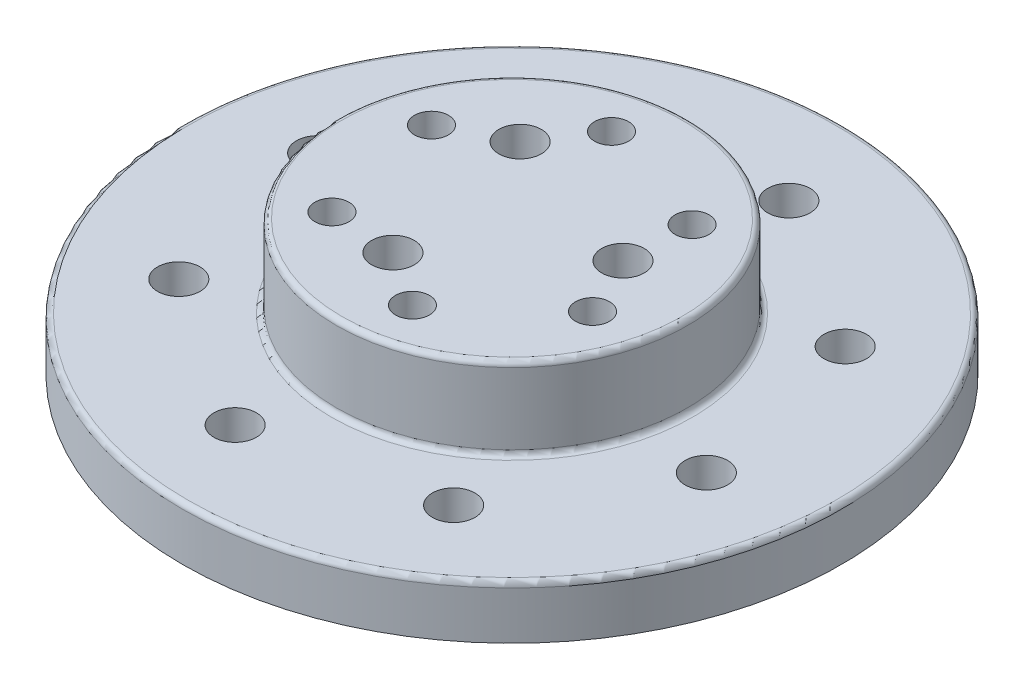
ISO-10303-21;
HEADER;
FILE_DESCRIPTION(('STEP AP214'),'2;1');
FILE_NAME('part.step','',(''),(''),'','','');
FILE_SCHEMA(('AUTOMOTIVE_DESIGN { 1 0 10303 214 1 1 1 1 }'));
ENDSEC;
DATA;
#1=APPLICATION_CONTEXT('core data for automotive mechanical design processes');
#2=APPLICATION_PROTOCOL_DEFINITION('international standard','automotive_design',2000,#1);
#3=PRODUCT_CONTEXT('',#1,'mechanical');
#4=PRODUCT('Part','Part','',(#3));
#5=PRODUCT_RELATED_PRODUCT_CATEGORY('part','',(#4));
#6=PRODUCT_DEFINITION_FORMATION('','',#4);
#7=PRODUCT_DEFINITION_CONTEXT('part definition',#1,'design');
#8=PRODUCT_DEFINITION('design','',#6,#7);
#9=PRODUCT_DEFINITION_SHAPE('','',#8);
#10=(LENGTH_UNIT() NAMED_UNIT(*) SI_UNIT(.MILLI.,.METRE.));
#11=(NAMED_UNIT(*) PLANE_ANGLE_UNIT() SI_UNIT($,.RADIAN.));
#12=(NAMED_UNIT(*) SI_UNIT($,.STERADIAN.) SOLID_ANGLE_UNIT());
#13=UNCERTAINTY_MEASURE_WITH_UNIT(LENGTH_MEASURE(1.E-05),#10,'distance_accuracy_value','');
#14=(GEOMETRIC_REPRESENTATION_CONTEXT(3) GLOBAL_UNCERTAINTY_ASSIGNED_CONTEXT((#13)) GLOBAL_UNIT_ASSIGNED_CONTEXT((#10,
#11,#12)) REPRESENTATION_CONTEXT('',''));
#15=CARTESIAN_POINT('',(0.,0.,0.));
#16=DIRECTION('',(0.,0.,1.));
#17=DIRECTION('',(1.,0.,0.));
#18=AXIS2_PLACEMENT_3D('',#15,#16,#17);
#19=CARTESIAN_POINT('',(0.,6.35,0.));
#20=DIRECTION('',(0.,-1.,0.));
#21=DIRECTION('',(0.,0.,-1.));
#22=AXIS2_PLACEMENT_3D('',#19,#20,#21);
#23=CYLINDRICAL_SURFACE('',#22,31.);
#24=CARTESIAN_POINT('',(0.,4.5,0.));
#25=DIRECTION('',(0.,1.,0.));
#26=DIRECTION('',(0.,0.,1.));
#27=AXIS2_PLACEMENT_3D('',#24,#25,#26);
#28=CIRCLE('',#27,31.);
#29=CARTESIAN_POINT('',(0.,4.5,31.));
#30=VERTEX_POINT('',#29);
#31=EDGE_CURVE('E11',#30,#30,#28,.F.);
#32=ORIENTED_EDGE('',*,*,#31,.T.);
#33=EDGE_LOOP('',(#32));
#34=FACE_BOUND('',#33,.T.);
#35=CARTESIAN_POINT('',(0.,0.,0.));
#36=DIRECTION('',(0.,1.,0.));
#37=DIRECTION('',(0.,0.,1.));
#38=AXIS2_PLACEMENT_3D('',#35,#36,#37);
#39=CIRCLE('',#38,31.);
#40=CARTESIAN_POINT('',(0.,0.,31.));
#41=VERTEX_POINT('',#40);
#42=EDGE_CURVE('E163',#41,#41,#39,.T.);
#43=ORIENTED_EDGE('',*,*,#42,.T.);
#44=EDGE_LOOP('',(#43));
#45=FACE_BOUND('',#44,.T.);
#46=ADVANCED_FACE('F41',(#34,#45),#23,.T.);
#47=CARTESIAN_POINT('',(-3.88151749889513,6.35,22.1626673012472));
#48=DIRECTION('',(0.,-1.,0.));
#49=DIRECTION('',(0.,0.,-1.));
#50=AXIS2_PLACEMENT_3D('',#47,#48,#49);
#51=CYLINDRICAL_SURFACE('',#50,2.00000000000001);
#52=CARTESIAN_POINT('',(-3.88151749889513,0.,22.1626673012472));
#53=DIRECTION('',(0.,-1.,0.));
#54=DIRECTION('',(0.,0.,-1.));
#55=AXIS2_PLACEMENT_3D('',#52,#53,#54);
#56=CIRCLE('',#55,2.00000000000001);
#57=CARTESIAN_POINT('',(-3.88151749889513,0.,20.1626673012472));
#58=VERTEX_POINT('',#57);
#59=EDGE_CURVE('E154',#58,#58,#56,.T.);
#60=ORIENTED_EDGE('',*,*,#59,.T.);
#61=EDGE_LOOP('',(#60));
#62=FACE_BOUND('',#61,.T.);
#63=CARTESIAN_POINT('',(-3.88151749889513,5.,22.1626673012472));
#64=DIRECTION('',(0.,1.,0.));
#65=DIRECTION('',(0.,0.,1.));
#66=AXIS2_PLACEMENT_3D('',#63,#64,#65);
#67=CIRCLE('',#66,2.00000000000001);
#68=CARTESIAN_POINT('',(-3.88151749889513,5.,24.1626673012472));
#69=VERTEX_POINT('',#68);
#70=EDGE_CURVE('E254',#69,#69,#67,.F.);
#71=ORIENTED_EDGE('',*,*,#70,.F.);
#72=EDGE_LOOP('',(#71));
#73=FACE_BOUND('',#72,.T.);
#74=ADVANCED_FACE('F247',(#62,#73),#51,.F.);
#75=CARTESIAN_POINT('',(-22.1626673012472,6.35,-3.88151749889513));
#76=DIRECTION('',(0.,-1.,0.));
#77=DIRECTION('',(0.,0.,-1.));
#78=AXIS2_PLACEMENT_3D('',#75,#76,#77);
#79=CYLINDRICAL_SURFACE('',#78,2.);
#80=CARTESIAN_POINT('',(-22.1626673012472,0.,-3.88151749889513));
#81=DIRECTION('',(0.,-1.,0.));
#82=DIRECTION('',(0.,0.,-1.));
#83=AXIS2_PLACEMENT_3D('',#80,#81,#82);
#84=CIRCLE('',#83,2.);
#85=CARTESIAN_POINT('',(-22.1626673012472,0.,-5.88151749889513));
#86=VERTEX_POINT('',#85);
#87=EDGE_CURVE('E216',#86,#86,#84,.T.);
#88=ORIENTED_EDGE('',*,*,#87,.T.);
#89=EDGE_LOOP('',(#88));
#90=FACE_BOUND('',#89,.T.);
#91=CARTESIAN_POINT('',(-22.1626673012472,5.,-3.88151749889513));
#92=DIRECTION('',(0.,1.,0.));
#93=DIRECTION('',(0.,0.,1.));
#94=AXIS2_PLACEMENT_3D('',#91,#92,#93);
#95=CIRCLE('',#94,2.);
#96=CARTESIAN_POINT('',(-22.1626673012472,5.,-1.88151749889514));
#97=VERTEX_POINT('',#96);
#98=EDGE_CURVE('E257',#97,#97,#95,.F.);
#99=ORIENTED_EDGE('',*,*,#98,.F.);
#100=EDGE_LOOP('',(#99));
#101=FACE_BOUND('',#100,.T.);
#102=ADVANCED_FACE('F250',(#90,#101),#79,.F.);
#103=CARTESIAN_POINT('',(-18.4160196826562,6.35,12.9267249931302));
#104=DIRECTION('',(0.,-1.,0.));
#105=DIRECTION('',(0.,0.,-1.));
#106=AXIS2_PLACEMENT_3D('',#103,#104,#105);
#107=CYLINDRICAL_SURFACE('',#106,2.);
#108=CARTESIAN_POINT('',(-18.4160196826562,0.,12.9267249931302));
#109=DIRECTION('',(0.,-1.,0.));
#110=DIRECTION('',(0.,0.,-1.));
#111=AXIS2_PLACEMENT_3D('',#108,#109,#110);
#112=CIRCLE('',#111,2.);
#113=CARTESIAN_POINT('',(-18.4160196826562,0.,10.9267249931302));
#114=VERTEX_POINT('',#113);
#115=EDGE_CURVE('E213',#114,#114,#112,.T.);
#116=ORIENTED_EDGE('',*,*,#115,.T.);
#117=EDGE_LOOP('',(#116));
#118=FACE_BOUND('',#117,.T.);
#119=CARTESIAN_POINT('',(-18.4160196826562,5.,12.9267249931302));
#120=DIRECTION('',(0.,1.,0.));
#121=DIRECTION('',(0.,0.,1.));
#122=AXIS2_PLACEMENT_3D('',#119,#120,#121);
#123=CIRCLE('',#122,2.);
#124=CARTESIAN_POINT('',(-18.4160196826562,5.,14.9267249931302));
#125=VERTEX_POINT('',#124);
#126=EDGE_CURVE('E263',#125,#125,#123,.F.);
#127=ORIENTED_EDGE('',*,*,#126,.F.);
#128=EDGE_LOOP('',(#127));
#129=FACE_BOUND('',#128,.T.);
#130=ADVANCED_FACE('F445',(#118,#129),#107,.F.);
#131=CARTESIAN_POINT('',(12.9267249931302,6.35,18.4160196826562));
#132=DIRECTION('',(0.,-1.,0.));
#133=DIRECTION('',(0.,0.,-1.));
#134=AXIS2_PLACEMENT_3D('',#131,#132,#133);
#135=CYLINDRICAL_SURFACE('',#134,2.);
#136=CARTESIAN_POINT('',(12.9267249931302,0.,18.4160196826562));
#137=DIRECTION('',(0.,-1.,0.));
#138=DIRECTION('',(0.,0.,-1.));
#139=AXIS2_PLACEMENT_3D('',#136,#137,#138);
#140=CIRCLE('',#139,2.);
#141=CARTESIAN_POINT('',(12.9267249931302,0.,16.4160196826562));
#142=VERTEX_POINT('',#141);
#143=EDGE_CURVE('E209',#142,#142,#140,.T.);
#144=ORIENTED_EDGE('',*,*,#143,.T.);
#145=EDGE_LOOP('',(#144));
#146=FACE_BOUND('',#145,.T.);
#147=CARTESIAN_POINT('',(12.9267249931302,5.,18.4160196826562));
#148=DIRECTION('',(0.,1.,0.));
#149=DIRECTION('',(0.,0.,1.));
#150=AXIS2_PLACEMENT_3D('',#147,#148,#149);
#151=CIRCLE('',#150,2.);
#152=CARTESIAN_POINT('',(12.9267249931302,5.,20.4160196826562));
#153=VERTEX_POINT('',#152);
#154=EDGE_CURVE('E616',#153,#153,#151,.F.);
#155=ORIENTED_EDGE('',*,*,#154,.F.);
#156=EDGE_LOOP('',(#155));
#157=FACE_BOUND('',#156,.T.);
#158=ADVANCED_FACE('F441',(#146,#157),#135,.F.);
#159=CARTESIAN_POINT('',(22.1626673012472,6.35,3.88151749889513));
#160=DIRECTION('',(0.,-1.,0.));
#161=DIRECTION('',(0.,0.,-1.));
#162=AXIS2_PLACEMENT_3D('',#159,#160,#161);
#163=CYLINDRICAL_SURFACE('',#162,2.00000000000001);
#164=CARTESIAN_POINT('',(22.1626673012472,0.,3.88151749889513));
#165=DIRECTION('',(0.,-1.,0.));
#166=DIRECTION('',(0.,0.,-1.));
#167=AXIS2_PLACEMENT_3D('',#164,#165,#166);
#168=CIRCLE('',#167,2.00000000000001);
#169=CARTESIAN_POINT('',(22.1626673012472,0.,1.88151749889512));
#170=VERTEX_POINT('',#169);
#171=EDGE_CURVE('E212',#170,#170,#168,.T.);
#172=ORIENTED_EDGE('',*,*,#171,.T.);
#173=EDGE_LOOP('',(#172));
#174=FACE_BOUND('',#173,.T.);
#175=CARTESIAN_POINT('',(22.1626673012472,5.,3.88151749889513));
#176=DIRECTION('',(0.,1.,0.));
#177=DIRECTION('',(0.,0.,1.));
#178=AXIS2_PLACEMENT_3D('',#175,#176,#177);
#179=CIRCLE('',#178,2.00000000000001);
#180=CARTESIAN_POINT('',(22.1626673012472,5.,5.88151749889514));
#181=VERTEX_POINT('',#180);
#182=EDGE_CURVE('E612',#181,#181,#179,.F.);
#183=ORIENTED_EDGE('',*,*,#182,.F.);
#184=EDGE_LOOP('',(#183));
#185=FACE_BOUND('',#184,.T.);
#186=ADVANCED_FACE('F230',(#174,#185),#163,.F.);
#187=CARTESIAN_POINT('',(18.4160196826562,6.35,-12.9267249931302));
#188=DIRECTION('',(0.,-1.,0.));
#189=DIRECTION('',(0.,0.,-1.));
#190=AXIS2_PLACEMENT_3D('',#187,#188,#189);
#191=CYLINDRICAL_SURFACE('',#190,2.00000000000001);
#192=CARTESIAN_POINT('',(18.4160196826562,0.,-12.9267249931302));
#193=DIRECTION('',(0.,-1.,0.));
#194=DIRECTION('',(0.,0.,-1.));
#195=AXIS2_PLACEMENT_3D('',#192,#193,#194);
#196=CIRCLE('',#195,2.00000000000001);
#197=CARTESIAN_POINT('',(18.4160196826562,0.,-14.9267249931302));
#198=VERTEX_POINT('',#197);
#199=EDGE_CURVE('E224',#198,#198,#196,.T.);
#200=ORIENTED_EDGE('',*,*,#199,.T.);
#201=EDGE_LOOP('',(#200));
#202=FACE_BOUND('',#201,.T.);
#203=CARTESIAN_POINT('',(18.4160196826562,5.,-12.9267249931302));
#204=DIRECTION('',(0.,1.,0.));
#205=DIRECTION('',(0.,0.,1.));
#206=AXIS2_PLACEMENT_3D('',#203,#204,#205);
#207=CIRCLE('',#206,2.00000000000001);
#208=CARTESIAN_POINT('',(18.4160196826562,5.,-10.9267249931302));
#209=VERTEX_POINT('',#208);
#210=EDGE_CURVE('E608',#209,#209,#207,.F.);
#211=ORIENTED_EDGE('',*,*,#210,.F.);
#212=EDGE_LOOP('',(#211));
#213=FACE_BOUND('',#212,.T.);
#214=ADVANCED_FACE('F430',(#202,#213),#191,.F.);
#215=CARTESIAN_POINT('',(3.88151749889513,6.35,-22.1626673012472));
#216=DIRECTION('',(0.,-1.,0.));
#217=DIRECTION('',(0.,0.,-1.));
#218=AXIS2_PLACEMENT_3D('',#215,#216,#217);
#219=CYLINDRICAL_SURFACE('',#218,2.00000000000001);
#220=CARTESIAN_POINT('',(3.88151749889513,0.,-22.1626673012472));
#221=DIRECTION('',(0.,-1.,0.));
#222=DIRECTION('',(0.,0.,-1.));
#223=AXIS2_PLACEMENT_3D('',#220,#221,#222);
#224=CIRCLE('',#223,2.00000000000001);
#225=CARTESIAN_POINT('',(3.88151749889513,0.,-24.1626673012472));
#226=VERTEX_POINT('',#225);
#227=EDGE_CURVE('E221',#226,#226,#224,.T.);
#228=ORIENTED_EDGE('',*,*,#227,.T.);
#229=EDGE_LOOP('',(#228));
#230=FACE_BOUND('',#229,.T.);
#231=CARTESIAN_POINT('',(3.88151749889513,5.,-22.1626673012472));
#232=DIRECTION('',(0.,1.,0.));
#233=DIRECTION('',(0.,0.,1.));
#234=AXIS2_PLACEMENT_3D('',#231,#232,#233);
#235=CIRCLE('',#234,2.00000000000001);
#236=CARTESIAN_POINT('',(3.88151749889513,5.,-20.1626673012472));
#237=VERTEX_POINT('',#236);
#238=EDGE_CURVE('E356',#237,#237,#235,.F.);
#239=ORIENTED_EDGE('',*,*,#238,.F.);
#240=EDGE_LOOP('',(#239));
#241=FACE_BOUND('',#240,.T.);
#242=ADVANCED_FACE('F424',(#230,#241),#219,.F.);
#243=CARTESIAN_POINT('',(-12.9267249931302,6.35,-18.4160196826562));
#244=DIRECTION('',(0.,-1.,0.));
#245=DIRECTION('',(0.,0.,-1.));
#246=AXIS2_PLACEMENT_3D('',#243,#244,#245);
#247=CYLINDRICAL_SURFACE('',#246,2.);
#248=CARTESIAN_POINT('',(-12.9267249931302,0.,-18.4160196826562));
#249=DIRECTION('',(0.,-1.,0.));
#250=DIRECTION('',(0.,0.,-1.));
#251=AXIS2_PLACEMENT_3D('',#248,#249,#250);
#252=CIRCLE('',#251,2.);
#253=CARTESIAN_POINT('',(-12.9267249931302,0.,-20.4160196826562));
#254=VERTEX_POINT('',#253);
#255=EDGE_CURVE('E159',#254,#254,#252,.T.);
#256=ORIENTED_EDGE('',*,*,#255,.T.);
#257=EDGE_LOOP('',(#256));
#258=FACE_BOUND('',#257,.T.);
#259=CARTESIAN_POINT('',(-12.9267249931302,5.,-18.4160196826562));
#260=DIRECTION('',(0.,1.,0.));
#261=DIRECTION('',(0.,0.,1.));
#262=AXIS2_PLACEMENT_3D('',#259,#260,#261);
#263=CIRCLE('',#262,2.);
#264=CARTESIAN_POINT('',(-12.9267249931302,5.,-16.4160196826562));
#265=VERTEX_POINT('',#264);
#266=EDGE_CURVE('E353',#265,#265,#263,.F.);
#267=ORIENTED_EDGE('',*,*,#266,.F.);
#268=EDGE_LOOP('',(#267));
#269=FACE_BOUND('',#268,.T.);
#270=ADVANCED_FACE('F421',(#258,#269),#247,.F.);
#271=CARTESIAN_POINT('',(0.,6.35,0.));
#272=DIRECTION('',(0.,-1.,0.));
#273=DIRECTION('',(0.,0.,-1.));
#274=AXIS2_PLACEMENT_3D('',#271,#272,#273);
#275=CYLINDRICAL_SURFACE('',#274,13.);
#276=DIRECTION('',(0.,1.,0.));
#277=VECTOR('',#276,1.);
#278=CARTESIAN_POINT('',(1.31010897798233,6.35,12.9338167014153));
#279=LINE('',#278,#277);
#280=CARTESIAN_POINT('',(1.31010897798233,0.,12.9338167014153));
#281=VERTEX_POINT('',#280);
#282=CARTESIAN_POINT('',(1.31010897798233,6.35,12.9338167014153));
#283=VERTEX_POINT('',#282);
#284=EDGE_CURVE('E153',#281,#283,#279,.T.);
#285=ORIENTED_EDGE('',*,*,#284,.F.);
#286=CARTESIAN_POINT('',(0.,0.,0.));
#287=DIRECTION('',(0.,1.,0.));
#288=DIRECTION('',(0.,0.,1.));
#289=AXIS2_PLACEMENT_3D('',#286,#287,#288);
#290=CIRCLE('',#289,13.);
#291=CARTESIAN_POINT('',(-8.82476180311893,0.,9.54586712238406));
#292=VERTEX_POINT('',#291);
#293=EDGE_CURVE('E145',#292,#281,#290,.T.);
#294=ORIENTED_EDGE('',*,*,#293,.F.);
#295=DIRECTION('',(0.,1.,0.));
#296=VECTOR('',#295,1.);
#297=CARTESIAN_POINT('',(-8.82476180311893,6.35,9.54586712238406));
#298=LINE('',#297,#296);
#299=CARTESIAN_POINT('',(-8.82476180311892,6.35,9.54586712238408));
#300=VERTEX_POINT('',#299);
#301=EDGE_CURVE('E128',#300,#292,#298,.F.);
#302=ORIENTED_EDGE('',*,*,#301,.F.);
#303=CARTESIAN_POINT('',(0.,6.35,0.));
#304=DIRECTION('',(0.,1.,0.));
#305=DIRECTION('',(0.,0.,1.));
#306=AXIS2_PLACEMENT_3D('',#303,#304,#305);
#307=CIRCLE('',#306,13.);
#308=EDGE_CURVE('E205',#300,#283,#307,.T.);
#309=ORIENTED_EDGE('',*,*,#308,.T.);
#310=EDGE_LOOP('',(#285,#294,#302,#309));
#311=FACE_BOUND('',#310,.T.);
#312=ADVANCED_FACE('F152',(#311),#275,.F.);
#313=DIRECTION('',(0.,1.,0.));
#314=VECTOR('',#313,1.);
#315=CARTESIAN_POINT('',(3.85458252722877,6.35,12.4154014651473));
#316=LINE('',#315,#314);
#317=CARTESIAN_POINT('',(3.85458252722878,6.35,12.4154014651473));
#318=VERTEX_POINT('',#317);
#319=CARTESIAN_POINT('',(3.85458252722877,0.,12.4154014651473));
#320=VERTEX_POINT('',#319);
#321=EDGE_CURVE('E202',#318,#320,#316,.F.);
#322=ORIENTED_EDGE('',*,*,#321,.F.);
#323=CARTESIAN_POINT('',(11.8560683205022,6.35,5.33232069361773));
#324=VERTEX_POINT('',#323);
#325=EDGE_CURVE('E208',#318,#324,#307,.T.);
#326=ORIENTED_EDGE('',*,*,#325,.T.);
#327=DIRECTION('',(0.,1.,0.));
#328=VECTOR('',#327,1.);
#329=CARTESIAN_POINT('',(11.8560683205022,6.35,5.33232069361772));
#330=LINE('',#329,#328);
#331=CARTESIAN_POINT('',(11.8560683205022,0.,5.33232069361772));
#332=VERTEX_POINT('',#331);
#333=EDGE_CURVE('E200',#332,#324,#330,.T.);
#334=ORIENTED_EDGE('',*,*,#333,.F.);
#335=EDGE_CURVE('E156',#320,#332,#290,.T.);
#336=ORIENTED_EDGE('',*,*,#335,.F.);
#337=EDGE_LOOP('',(#322,#326,#334,#336));
#338=FACE_BOUND('',#337,.T.);
#339=ADVANCED_FACE('F398',(#338),#275,.F.);
#340=DIRECTION('',(0.,1.,0.));
#341=VECTOR('',#340,1.);
#342=CARTESIAN_POINT('',(12.679344330493,6.35,2.86953434354699));
#343=LINE('',#342,#341);
#344=CARTESIAN_POINT('',(12.679344330493,6.35,2.86953434354699));
#345=VERTEX_POINT('',#344);
#346=CARTESIAN_POINT('',(12.679344330493,0.,2.86953434354699));
#347=VERTEX_POINT('',#346);
#348=EDGE_CURVE('E198',#345,#347,#343,.F.);
#349=ORIENTED_EDGE('',*,*,#348,.F.);
#350=CARTESIAN_POINT('',(10.5459593415696,6.35,-7.60149600841571));
#351=VERTEX_POINT('',#350);
#352=EDGE_CURVE('E384',#345,#351,#307,.T.);
#353=ORIENTED_EDGE('',*,*,#352,.T.);
#354=DIRECTION('',(0.,1.,0.));
#355=VECTOR('',#354,1.);
#356=CARTESIAN_POINT('',(10.5459593415696,6.35,-7.60149600841571));
#357=LINE('',#356,#355);
#358=CARTESIAN_POINT('',(10.5459593415696,0.,-7.60149600841571));
#359=VERTEX_POINT('',#358);
#360=EDGE_CURVE('E196',#359,#351,#357,.T.);
#361=ORIENTED_EDGE('',*,*,#360,.F.);
#362=EDGE_CURVE('E164',#347,#359,#290,.T.);
#363=ORIENTED_EDGE('',*,*,#362,.F.);
#364=EDGE_LOOP('',(#349,#353,#361,#363));
#365=FACE_BOUND('',#364,.T.);
#366=ADVANCED_FACE('F402',(#365),#275,.F.);
#367=DIRECTION('',(0.,1.,0.));
#368=VECTOR('',#367,1.);
#369=CARTESIAN_POINT('',(8.82476180318881,6.35,-9.54586712231947));
#370=LINE('',#369,#368);
#371=CARTESIAN_POINT('',(8.8247618031888,6.35,-9.54586712231948));
#372=VERTEX_POINT('',#371);
#373=CARTESIAN_POINT('',(8.82476180318881,0.,-9.54586712231947));
#374=VERTEX_POINT('',#373);
#375=EDGE_CURVE('E194',#372,#374,#370,.F.);
#376=ORIENTED_EDGE('',*,*,#375,.F.);
#377=CARTESIAN_POINT('',(-1.31010897872448,6.35,-12.9338167013402));
#378=VERTEX_POINT('',#377);
#379=EDGE_CURVE('E382',#372,#378,#307,.T.);
#380=ORIENTED_EDGE('',*,*,#379,.T.);
#381=DIRECTION('',(0.,1.,0.));
#382=VECTOR('',#381,1.);
#383=CARTESIAN_POINT('',(-1.31010897872449,6.35,-12.9338167013401));
#384=LINE('',#383,#382);
#385=CARTESIAN_POINT('',(-1.31010897872449,0.,-12.9338167013401));
#386=VERTEX_POINT('',#385);
#387=EDGE_CURVE('E188',#386,#378,#384,.T.);
#388=ORIENTED_EDGE('',*,*,#387,.F.);
#389=EDGE_CURVE('E169',#374,#386,#290,.T.);
#390=ORIENTED_EDGE('',*,*,#389,.F.);
#391=EDGE_LOOP('',(#376,#380,#388,#390));
#392=FACE_BOUND('',#391,.T.);
#393=ADVANCED_FACE('F409',(#392),#275,.F.);
#394=DIRECTION('',(0.,1.,0.));
#395=VECTOR('',#394,1.);
#396=CARTESIAN_POINT('',(-3.85458252793766,6.35,-12.4154014649272));
#397=LINE('',#396,#395);
#398=CARTESIAN_POINT('',(-3.85458252793767,6.35,-12.4154014649272));
#399=VERTEX_POINT('',#398);
#400=CARTESIAN_POINT('',(-3.85458252793766,0.,-12.4154014649272));
#401=VERTEX_POINT('',#400);
#402=EDGE_CURVE('E183',#399,#401,#397,.F.);
#403=ORIENTED_EDGE('',*,*,#402,.F.);
#404=CARTESIAN_POINT('',(-11.8560683204658,6.35,-5.33232069369878));
#405=VERTEX_POINT('',#404);
#406=EDGE_CURVE('E185',#399,#405,#307,.T.);
#407=ORIENTED_EDGE('',*,*,#406,.T.);
#408=DIRECTION('',(0.,1.,0.));
#409=VECTOR('',#408,1.);
#410=CARTESIAN_POINT('',(-11.8560683204658,6.35,-5.33232069369877));
#411=LINE('',#410,#409);
#412=CARTESIAN_POINT('',(-11.8560683204658,0.,-5.33232069369877));
#413=VERTEX_POINT('',#412);
#414=EDGE_CURVE('E64',#413,#405,#411,.T.);
#415=ORIENTED_EDGE('',*,*,#414,.F.);
#416=EDGE_CURVE('E157',#401,#413,#290,.T.);
#417=ORIENTED_EDGE('',*,*,#416,.F.);
#418=EDGE_LOOP('',(#403,#407,#415,#417));
#419=FACE_BOUND('',#418,.T.);
#420=ADVANCED_FACE('F181',(#419),#275,.F.);
#421=DIRECTION('',(0.,1.,0.));
#422=VECTOR('',#421,1.);
#423=CARTESIAN_POINT('',(-12.6793443306778,6.35,-2.86953434273023));
#424=LINE('',#423,#422);
#425=CARTESIAN_POINT('',(-12.6793443306778,6.35,-2.86953434273022));
#426=VERTEX_POINT('',#425);
#427=CARTESIAN_POINT('',(-12.6793443306778,0.,-2.86953434273023));
#428=VERTEX_POINT('',#427);
#429=EDGE_CURVE('E186',#426,#428,#424,.F.);
#430=ORIENTED_EDGE('',*,*,#429,.F.);
#431=CARTESIAN_POINT('',(-10.5459593420578,6.35,7.60149600773846));
#432=VERTEX_POINT('',#431);
#433=EDGE_CURVE('E207',#426,#432,#307,.T.);
#434=ORIENTED_EDGE('',*,*,#433,.T.);
#435=DIRECTION('',(0.,1.,0.));
#436=VECTOR('',#435,1.);
#437=CARTESIAN_POINT('',(-10.5459593420578,6.35,7.60149600773847));
#438=LINE('',#437,#436);
#439=CARTESIAN_POINT('',(-10.5459593420578,0.,7.60149600773847));
#440=VERTEX_POINT('',#439);
#441=EDGE_CURVE('E56',#440,#432,#438,.T.);
#442=ORIENTED_EDGE('',*,*,#441,.F.);
#443=EDGE_CURVE('E148',#428,#440,#290,.T.);
#444=ORIENTED_EDGE('',*,*,#443,.F.);
#445=EDGE_LOOP('',(#430,#434,#442,#444));
#446=FACE_BOUND('',#445,.T.);
#447=ADVANCED_FACE('F236',(#446),#275,.F.);
#448=CARTESIAN_POINT('',(0.,0.,0.));
#449=DIRECTION('',(0.,1.,0.));
#450=DIRECTION('',(0.,0.,1.));
#451=AXIS2_PLACEMENT_3D('',#448,#449,#450);
#452=PLANE('',#451);
#453=ORIENTED_EDGE('',*,*,#255,.F.);
#454=EDGE_LOOP('',(#453));
#455=FACE_BOUND('',#454,.T.);
#456=ORIENTED_EDGE('',*,*,#227,.F.);
#457=EDGE_LOOP('',(#456));
#458=FACE_BOUND('',#457,.T.);
#459=ORIENTED_EDGE('',*,*,#199,.F.);
#460=EDGE_LOOP('',(#459));
#461=FACE_BOUND('',#460,.T.);
#462=ORIENTED_EDGE('',*,*,#171,.F.);
#463=EDGE_LOOP('',(#462));
#464=FACE_BOUND('',#463,.T.);
#465=ORIENTED_EDGE('',*,*,#143,.F.);
#466=EDGE_LOOP('',(#465));
#467=FACE_BOUND('',#466,.T.);
#468=ORIENTED_EDGE('',*,*,#115,.F.);
#469=EDGE_LOOP('',(#468));
#470=FACE_BOUND('',#469,.T.);
#471=ORIENTED_EDGE('',*,*,#87,.F.);
#472=EDGE_LOOP('',(#471));
#473=FACE_BOUND('',#472,.T.);
#474=ORIENTED_EDGE('',*,*,#59,.F.);
#475=EDGE_LOOP('',(#474));
#476=FACE_BOUND('',#475,.T.);
#477=ORIENTED_EDGE('',*,*,#293,.T.);
#478=CARTESIAN_POINT('',(2.39568218254889,0.,11.7584313103511));
#479=DIRECTION('',(0.,1.,0.));
#480=DIRECTION('',(0.,0.,1.));
#481=AXIS2_PLACEMENT_3D('',#478,#479,#480);
#482=CIRCLE('',#481,1.6);
#483=EDGE_CURVE('E294',#281,#320,#482,.T.);
#484=ORIENTED_EDGE('',*,*,#483,.T.);
#485=ORIENTED_EDGE('',*,*,#335,.T.);
#486=CARTESIAN_POINT('',(11.3809413140594,0.,3.80449402552062));
#487=DIRECTION('',(0.,1.,0.));
#488=DIRECTION('',(0.,0.,1.));
#489=AXIS2_PLACEMENT_3D('',#486,#487,#488);
#490=CIRCLE('',#489,1.6);
#491=EDGE_CURVE('E289',#332,#347,#490,.T.);
#492=ORIENTED_EDGE('',*,*,#491,.T.);
#493=ORIENTED_EDGE('',*,*,#362,.T.);
#494=CARTESIAN_POINT('',(8.98525913117424,0.,-7.95393728476081));
#495=DIRECTION('',(0.,1.,0.));
#496=DIRECTION('',(0.,0.,1.));
#497=AXIS2_PLACEMENT_3D('',#494,#495,#496);
#498=CIRCLE('',#497,1.6);
#499=EDGE_CURVE('E284',#359,#374,#498,.T.);
#500=ORIENTED_EDGE('',*,*,#499,.T.);
#501=ORIENTED_EDGE('',*,*,#389,.T.);
#502=CARTESIAN_POINT('',(-2.39568218322146,0.,-11.7584313102117));
#503=DIRECTION('',(0.,1.,0.));
#504=DIRECTION('',(0.,0.,1.));
#505=AXIS2_PLACEMENT_3D('',#502,#503,#504);
#506=CIRCLE('',#505,1.6);
#507=EDGE_CURVE('E178',#386,#401,#506,.T.);
#508=ORIENTED_EDGE('',*,*,#507,.T.);
#509=ORIENTED_EDGE('',*,*,#416,.T.);
#510=CARTESIAN_POINT('',(-11.380941314732,0.,-3.80449402538117));
#511=DIRECTION('',(0.,1.,0.));
#512=DIRECTION('',(0.,0.,1.));
#513=AXIS2_PLACEMENT_3D('',#510,#511,#512);
#514=CIRCLE('',#513,1.6);
#515=EDGE_CURVE('E177',#413,#428,#514,.T.);
#516=ORIENTED_EDGE('',*,*,#515,.T.);
#517=ORIENTED_EDGE('',*,*,#443,.T.);
#518=CARTESIAN_POINT('',(-8.98525913184681,0.,7.95393728490025));
#519=DIRECTION('',(0.,1.,0.));
#520=DIRECTION('',(0.,0.,1.));
#521=AXIS2_PLACEMENT_3D('',#518,#519,#520);
#522=CIRCLE('',#521,1.6);
#523=EDGE_CURVE('E132',#440,#292,#522,.T.);
#524=ORIENTED_EDGE('',*,*,#523,.T.);
#525=EDGE_LOOP('',(#477,#484,#485,#492,#493,#500,#501,#508,#509,#516,#517,#524));
#526=FACE_BOUND('',#525,.T.);
#527=ORIENTED_EDGE('',*,*,#42,.F.);
#528=EDGE_LOOP('',(#527));
#529=FACE_BOUND('',#528,.T.);
#530=ADVANCED_FACE('F142',(#455,#458,#461,#464,#467,#470,#473,#476,#526,#529),#452,.F.);
#531=CARTESIAN_POINT('',(0.,12.7,0.));
#532=DIRECTION('',(0.,1.,0.));
#533=DIRECTION('',(0.,0.,1.));
#534=AXIS2_PLACEMENT_3D('',#531,#532,#533);
#535=PLANE('',#534);
#536=CARTESIAN_POINT('',(0.,12.7,0.));
#537=DIRECTION('',(0.,1.,0.));
#538=DIRECTION('',(0.,0.,1.));
#539=AXIS2_PLACEMENT_3D('',#536,#537,#538);
#540=CIRCLE('',#539,16.);
#541=CARTESIAN_POINT('',(0.,12.7,16.));
#542=VERTEX_POINT('',#541);
#543=EDGE_CURVE('E49',#542,#542,#540,.T.);
#544=ORIENTED_EDGE('',*,*,#543,.T.);
#545=EDGE_LOOP('',(#544));
#546=FACE_BOUND('',#545,.T.);
#547=CARTESIAN_POINT('',(-2.80581434414375,12.7,8.39344421925283));
#548=DIRECTION('',(0.,1.,0.));
#549=DIRECTION('',(0.,0.,1.));
#550=AXIS2_PLACEMENT_3D('',#547,#548,#549);
#551=CIRCLE('',#550,2.);
#552=CARTESIAN_POINT('',(-2.80581434414375,12.7,10.3934442192528));
#553=VERTEX_POINT('',#552);
#554=EDGE_CURVE('E267',#553,#553,#551,.T.);
#555=ORIENTED_EDGE('',*,*,#554,.F.);
#556=EDGE_LOOP('',(#555));
#557=FACE_BOUND('',#556,.T.);
#558=CARTESIAN_POINT('',(-5.86602874786137,12.7,-6.62662860923556));
#559=DIRECTION('',(0.,1.,0.));
#560=DIRECTION('',(0.,0.,1.));
#561=AXIS2_PLACEMENT_3D('',#558,#559,#560);
#562=CIRCLE('',#561,2.);
#563=CARTESIAN_POINT('',(-5.86602874786137,12.7,-4.62662860923556));
#564=VERTEX_POINT('',#563);
#565=EDGE_CURVE('E260',#564,#564,#562,.T.);
#566=ORIENTED_EDGE('',*,*,#565,.F.);
#567=EDGE_LOOP('',(#566));
#568=FACE_BOUND('',#567,.T.);
#569=CARTESIAN_POINT('',(8.67184309099626,12.7,-1.7668156098081));
#570=DIRECTION('',(0.,1.,0.));
#571=DIRECTION('',(0.,0.,1.));
#572=AXIS2_PLACEMENT_3D('',#569,#570,#571);
#573=CIRCLE('',#572,2.);
#574=CARTESIAN_POINT('',(8.67184309099626,12.7,0.233184390191904));
#575=VERTEX_POINT('',#574);
#576=EDGE_CURVE('E256',#575,#575,#573,.T.);
#577=ORIENTED_EDGE('',*,*,#576,.F.);
#578=EDGE_LOOP('',(#577));
#579=FACE_BOUND('',#578,.T.);
#580=CARTESIAN_POINT('',(2.39568218254889,12.7,11.7584313103511));
#581=DIRECTION('',(0.,1.,0.));
#582=DIRECTION('',(0.,0.,1.));
#583=AXIS2_PLACEMENT_3D('',#580,#581,#582);
#584=CIRCLE('',#583,1.6);
#585=CARTESIAN_POINT('',(2.39568218254889,12.7,13.3584313103511));
#586=VERTEX_POINT('',#585);
#587=EDGE_CURVE('E291',#586,#586,#584,.T.);
#588=ORIENTED_EDGE('',*,*,#587,.F.);
#589=EDGE_LOOP('',(#588));
#590=FACE_BOUND('',#589,.T.);
#591=CARTESIAN_POINT('',(11.3809413140594,12.7,3.80449402552062));
#592=DIRECTION('',(0.,1.,0.));
#593=DIRECTION('',(0.,0.,1.));
#594=AXIS2_PLACEMENT_3D('',#591,#592,#593);
#595=CIRCLE('',#594,1.6);
#596=CARTESIAN_POINT('',(11.3809413140594,12.7,5.40449402552062));
#597=VERTEX_POINT('',#596);
#598=EDGE_CURVE('E286',#597,#597,#595,.T.);
#599=ORIENTED_EDGE('',*,*,#598,.F.);
#600=EDGE_LOOP('',(#599));
#601=FACE_BOUND('',#600,.T.);
#602=CARTESIAN_POINT('',(8.98525913117424,12.7,-7.95393728476081));
#603=DIRECTION('',(0.,1.,0.));
#604=DIRECTION('',(0.,0.,1.));
#605=AXIS2_PLACEMENT_3D('',#602,#603,#604);
#606=CIRCLE('',#605,1.6);
#607=CARTESIAN_POINT('',(8.98525913117424,12.7,-6.3539372847608));
#608=VERTEX_POINT('',#607);
#609=EDGE_CURVE('E281',#608,#608,#606,.T.);
#610=ORIENTED_EDGE('',*,*,#609,.F.);
#611=EDGE_LOOP('',(#610));
#612=FACE_BOUND('',#611,.T.);
#613=CARTESIAN_POINT('',(-2.39568218322146,12.7,-11.7584313102117));
#614=DIRECTION('',(0.,1.,0.));
#615=DIRECTION('',(0.,0.,1.));
#616=AXIS2_PLACEMENT_3D('',#613,#614,#615);
#617=CIRCLE('',#616,1.6);
#618=CARTESIAN_POINT('',(-2.39568218322146,12.7,-10.1584313102117));
#619=VERTEX_POINT('',#618);
#620=EDGE_CURVE('E277',#619,#619,#617,.T.);
#621=ORIENTED_EDGE('',*,*,#620,.F.);
#622=EDGE_LOOP('',(#621));
#623=FACE_BOUND('',#622,.T.);
#624=CARTESIAN_POINT('',(-11.380941314732,12.7,-3.80449402538117));
#625=DIRECTION('',(0.,1.,0.));
#626=DIRECTION('',(0.,0.,1.));
#627=AXIS2_PLACEMENT_3D('',#624,#625,#626);
#628=CIRCLE('',#627,1.6);
#629=CARTESIAN_POINT('',(-11.380941314732,12.7,-2.20449402538117));
#630=VERTEX_POINT('',#629);
#631=EDGE_CURVE('E273',#630,#630,#628,.T.);
#632=ORIENTED_EDGE('',*,*,#631,.F.);
#633=EDGE_LOOP('',(#632));
#634=FACE_BOUND('',#633,.T.);
#635=CARTESIAN_POINT('',(-8.98525913184681,12.7,7.95393728490025));
#636=DIRECTION('',(0.,1.,0.));
#637=DIRECTION('',(0.,0.,1.));
#638=AXIS2_PLACEMENT_3D('',#635,#636,#637);
#639=CIRCLE('',#638,1.6);
#640=CARTESIAN_POINT('',(-8.98525913184681,12.7,9.55393728490025));
#641=VERTEX_POINT('',#640);
#642=EDGE_CURVE('E149',#641,#641,#639,.T.);
#643=ORIENTED_EDGE('',*,*,#642,.F.);
#644=EDGE_LOOP('',(#643));
#645=FACE_BOUND('',#644,.T.);
#646=ADVANCED_FACE('F235',(#546,#557,#568,#579,#590,#601,#612,#623,#634,#645),#535,.T.);
#647=CARTESIAN_POINT('',(0.,12.7,0.));
#648=DIRECTION('',(0.,-1.,0.));
#649=DIRECTION('',(0.,0.,-1.));
#650=AXIS2_PLACEMENT_3D('',#647,#648,#649);
#651=CYLINDRICAL_SURFACE('',#650,16.5);
#652=CARTESIAN_POINT('',(0.,5.5,0.));
#653=DIRECTION('',(0.,1.,0.));
#654=DIRECTION('',(0.,0.,1.));
#655=AXIS2_PLACEMENT_3D('',#652,#653,#654);
#656=CIRCLE('',#655,16.5);
#657=CARTESIAN_POINT('',(0.,5.5,16.5));
#658=VERTEX_POINT('',#657);
#659=EDGE_CURVE('E348',#658,#658,#656,.T.);
#660=ORIENTED_EDGE('',*,*,#659,.T.);
#661=EDGE_LOOP('',(#660));
#662=FACE_BOUND('',#661,.T.);
#663=CARTESIAN_POINT('',(0.,12.2,0.));
#664=DIRECTION('',(0.,1.,0.));
#665=DIRECTION('',(0.,0.,1.));
#666=AXIS2_PLACEMENT_3D('',#663,#664,#665);
#667=CIRCLE('',#666,16.5);
#668=CARTESIAN_POINT('',(0.,12.2,16.5));
#669=VERTEX_POINT('',#668);
#670=EDGE_CURVE('E339',#669,#669,#667,.F.);
#671=ORIENTED_EDGE('',*,*,#670,.T.);
#672=EDGE_LOOP('',(#671));
#673=FACE_BOUND('',#672,.T.);
#674=ADVANCED_FACE('F301',(#662,#673),#651,.T.);
#675=CARTESIAN_POINT('',(0.,6.35,0.));
#676=DIRECTION('',(0.,1.,0.));
#677=DIRECTION('',(0.,0.,1.));
#678=AXIS2_PLACEMENT_3D('',#675,#676,#677);
#679=PLANE('',#678);
#680=CARTESIAN_POINT('',(-2.80581434414375,6.35,8.39344421925283));
#681=DIRECTION('',(0.,1.,0.));
#682=DIRECTION('',(0.,0.,1.));
#683=AXIS2_PLACEMENT_3D('',#680,#681,#682);
#684=CIRCLE('',#683,2.);
#685=CARTESIAN_POINT('',(-2.80581434414375,6.35,10.3934442192528));
#686=VERTEX_POINT('',#685);
#687=EDGE_CURVE('E295',#686,#686,#684,.T.);
#688=ORIENTED_EDGE('',*,*,#687,.T.);
#689=EDGE_LOOP('',(#688));
#690=FACE_BOUND('',#689,.T.);
#691=CARTESIAN_POINT('',(-5.86602874786137,6.35,-6.62662860923556));
#692=DIRECTION('',(0.,1.,0.));
#693=DIRECTION('',(0.,0.,1.));
#694=AXIS2_PLACEMENT_3D('',#691,#692,#693);
#695=CIRCLE('',#694,2.);
#696=CARTESIAN_POINT('',(-5.86602874786137,6.35,-4.62662860923556));
#697=VERTEX_POINT('',#696);
#698=EDGE_CURVE('E359',#697,#697,#695,.T.);
#699=ORIENTED_EDGE('',*,*,#698,.T.);
#700=EDGE_LOOP('',(#699));
#701=FACE_BOUND('',#700,.T.);
#702=CARTESIAN_POINT('',(8.67184309099626,6.35,-1.7668156098081));
#703=DIRECTION('',(0.,1.,0.));
#704=DIRECTION('',(0.,0.,1.));
#705=AXIS2_PLACEMENT_3D('',#702,#703,#704);
#706=CIRCLE('',#705,2.);
#707=CARTESIAN_POINT('',(8.67184309099626,6.35,0.233184390191904));
#708=VERTEX_POINT('',#707);
#709=EDGE_CURVE('E270',#708,#708,#706,.T.);
#710=ORIENTED_EDGE('',*,*,#709,.T.);
#711=EDGE_LOOP('',(#710));
#712=FACE_BOUND('',#711,.T.);
#713=ORIENTED_EDGE('',*,*,#325,.F.);
#714=CARTESIAN_POINT('',(2.39568218254889,6.35,11.7584313103511));
#715=DIRECTION('',(0.,1.,0.));
#716=DIRECTION('',(0.,0.,1.));
#717=AXIS2_PLACEMENT_3D('',#714,#715,#716);
#718=CIRCLE('',#717,1.6);
#719=EDGE_CURVE('E352',#318,#283,#718,.T.);
#720=ORIENTED_EDGE('',*,*,#719,.T.);
#721=ORIENTED_EDGE('',*,*,#308,.F.);
#722=CARTESIAN_POINT('',(-8.98525913184681,6.35,7.95393728490025));
#723=DIRECTION('',(0.,1.,0.));
#724=DIRECTION('',(0.,0.,1.));
#725=AXIS2_PLACEMENT_3D('',#722,#723,#724);
#726=CIRCLE('',#725,1.6);
#727=EDGE_CURVE('E133',#300,#432,#726,.T.);
#728=ORIENTED_EDGE('',*,*,#727,.T.);
#729=ORIENTED_EDGE('',*,*,#433,.F.);
#730=CARTESIAN_POINT('',(-11.380941314732,6.35,-3.80449402538117));
#731=DIRECTION('',(0.,1.,0.));
#732=DIRECTION('',(0.,0.,1.));
#733=AXIS2_PLACEMENT_3D('',#730,#731,#732);
#734=CIRCLE('',#733,1.6);
#735=EDGE_CURVE('E375',#426,#405,#734,.T.);
#736=ORIENTED_EDGE('',*,*,#735,.T.);
#737=ORIENTED_EDGE('',*,*,#406,.F.);
#738=CARTESIAN_POINT('',(-2.39568218322146,6.35,-11.7584313102117));
#739=DIRECTION('',(0.,1.,0.));
#740=DIRECTION('',(0.,0.,1.));
#741=AXIS2_PLACEMENT_3D('',#738,#739,#740);
#742=CIRCLE('',#741,1.6);
#743=EDGE_CURVE('E372',#399,#378,#742,.T.);
#744=ORIENTED_EDGE('',*,*,#743,.T.);
#745=ORIENTED_EDGE('',*,*,#379,.F.);
#746=CARTESIAN_POINT('',(8.98525913117424,6.35,-7.95393728476081));
#747=DIRECTION('',(0.,1.,0.));
#748=DIRECTION('',(0.,0.,1.));
#749=AXIS2_PLACEMENT_3D('',#746,#747,#748);
#750=CIRCLE('',#749,1.6);
#751=EDGE_CURVE('E369',#372,#351,#750,.T.);
#752=ORIENTED_EDGE('',*,*,#751,.T.);
#753=ORIENTED_EDGE('',*,*,#352,.F.);
#754=CARTESIAN_POINT('',(11.3809413140594,6.35,3.80449402552062));
#755=DIRECTION('',(0.,1.,0.));
#756=DIRECTION('',(0.,0.,1.));
#757=AXIS2_PLACEMENT_3D('',#754,#755,#756);
#758=CIRCLE('',#757,1.6);
#759=EDGE_CURVE('E366',#345,#324,#758,.T.);
#760=ORIENTED_EDGE('',*,*,#759,.T.);
#761=EDGE_LOOP('',(#713,#720,#721,#728,#729,#736,#737,#744,#745,#752,#753,#760));
#762=FACE_BOUND('',#761,.T.);
#763=ADVANCED_FACE('F308',(#690,#701,#712,#762),#679,.F.);
#764=CARTESIAN_POINT('',(-8.98525913184681,0.,7.95393728490025));
#765=DIRECTION('',(0.,1.,0.));
#766=DIRECTION('',(0.,0.,1.));
#767=AXIS2_PLACEMENT_3D('',#764,#765,#766);
#768=CYLINDRICAL_SURFACE('',#767,1.6);
#769=ORIENTED_EDGE('',*,*,#441,.T.);
#770=ORIENTED_EDGE('',*,*,#727,.F.);
#771=ORIENTED_EDGE('',*,*,#301,.T.);
#772=ORIENTED_EDGE('',*,*,#523,.F.);
#773=EDGE_LOOP('',(#769,#770,#771,#772));
#774=FACE_BOUND('',#773,.T.);
#775=ORIENTED_EDGE('',*,*,#642,.T.);
#776=EDGE_LOOP('',(#775));
#777=FACE_BOUND('',#776,.T.);
#778=ADVANCED_FACE('F130',(#774,#777),#768,.F.);
#779=CARTESIAN_POINT('',(-11.380941314732,0.,-3.80449402538117));
#780=DIRECTION('',(0.,1.,0.));
#781=DIRECTION('',(0.,0.,1.));
#782=AXIS2_PLACEMENT_3D('',#779,#780,#781);
#783=CYLINDRICAL_SURFACE('',#782,1.6);
#784=ORIENTED_EDGE('',*,*,#414,.T.);
#785=ORIENTED_EDGE('',*,*,#735,.F.);
#786=ORIENTED_EDGE('',*,*,#429,.T.);
#787=ORIENTED_EDGE('',*,*,#515,.F.);
#788=EDGE_LOOP('',(#784,#785,#786,#787));
#789=FACE_BOUND('',#788,.T.);
#790=ORIENTED_EDGE('',*,*,#631,.T.);
#791=EDGE_LOOP('',(#790));
#792=FACE_BOUND('',#791,.T.);
#793=ADVANCED_FACE('F460',(#789,#792),#783,.F.);
#794=CARTESIAN_POINT('',(-2.39568218322146,0.,-11.7584313102117));
#795=DIRECTION('',(0.,1.,0.));
#796=DIRECTION('',(0.,0.,1.));
#797=AXIS2_PLACEMENT_3D('',#794,#795,#796);
#798=CYLINDRICAL_SURFACE('',#797,1.6);
#799=ORIENTED_EDGE('',*,*,#387,.T.);
#800=ORIENTED_EDGE('',*,*,#743,.F.);
#801=ORIENTED_EDGE('',*,*,#402,.T.);
#802=ORIENTED_EDGE('',*,*,#507,.F.);
#803=EDGE_LOOP('',(#799,#800,#801,#802));
#804=FACE_BOUND('',#803,.T.);
#805=ORIENTED_EDGE('',*,*,#620,.T.);
#806=EDGE_LOOP('',(#805));
#807=FACE_BOUND('',#806,.T.);
#808=ADVANCED_FACE('F407',(#804,#807),#798,.F.);
#809=CARTESIAN_POINT('',(8.98525913117424,0.,-7.95393728476081));
#810=DIRECTION('',(0.,1.,0.));
#811=DIRECTION('',(0.,0.,1.));
#812=AXIS2_PLACEMENT_3D('',#809,#810,#811);
#813=CYLINDRICAL_SURFACE('',#812,1.6);
#814=ORIENTED_EDGE('',*,*,#360,.T.);
#815=ORIENTED_EDGE('',*,*,#751,.F.);
#816=ORIENTED_EDGE('',*,*,#375,.T.);
#817=ORIENTED_EDGE('',*,*,#499,.F.);
#818=EDGE_LOOP('',(#814,#815,#816,#817));
#819=FACE_BOUND('',#818,.T.);
#820=ORIENTED_EDGE('',*,*,#609,.T.);
#821=EDGE_LOOP('',(#820));
#822=FACE_BOUND('',#821,.T.);
#823=ADVANCED_FACE('F404',(#819,#822),#813,.F.);
#824=CARTESIAN_POINT('',(11.3809413140594,0.,3.80449402552062));
#825=DIRECTION('',(0.,1.,0.));
#826=DIRECTION('',(0.,0.,1.));
#827=AXIS2_PLACEMENT_3D('',#824,#825,#826);
#828=CYLINDRICAL_SURFACE('',#827,1.6);
#829=ORIENTED_EDGE('',*,*,#333,.T.);
#830=ORIENTED_EDGE('',*,*,#759,.F.);
#831=ORIENTED_EDGE('',*,*,#348,.T.);
#832=ORIENTED_EDGE('',*,*,#491,.F.);
#833=EDGE_LOOP('',(#829,#830,#831,#832));
#834=FACE_BOUND('',#833,.T.);
#835=ORIENTED_EDGE('',*,*,#598,.T.);
#836=EDGE_LOOP('',(#835));
#837=FACE_BOUND('',#836,.T.);
#838=ADVANCED_FACE('F400',(#834,#837),#828,.F.);
#839=CARTESIAN_POINT('',(2.39568218254889,0.,11.7584313103511));
#840=DIRECTION('',(0.,1.,0.));
#841=DIRECTION('',(0.,0.,1.));
#842=AXIS2_PLACEMENT_3D('',#839,#840,#841);
#843=CYLINDRICAL_SURFACE('',#842,1.6);
#844=ORIENTED_EDGE('',*,*,#284,.T.);
#845=ORIENTED_EDGE('',*,*,#719,.F.);
#846=ORIENTED_EDGE('',*,*,#321,.T.);
#847=ORIENTED_EDGE('',*,*,#483,.F.);
#848=EDGE_LOOP('',(#844,#845,#846,#847));
#849=FACE_BOUND('',#848,.T.);
#850=ORIENTED_EDGE('',*,*,#587,.T.);
#851=EDGE_LOOP('',(#850));
#852=FACE_BOUND('',#851,.T.);
#853=ADVANCED_FACE('F469',(#849,#852),#843,.F.);
#854=CARTESIAN_POINT('',(8.67184309099626,0.,-1.7668156098081));
#855=DIRECTION('',(0.,1.,0.));
#856=DIRECTION('',(0.,0.,1.));
#857=AXIS2_PLACEMENT_3D('',#854,#855,#856);
#858=CYLINDRICAL_SURFACE('',#857,2.);
#859=ORIENTED_EDGE('',*,*,#576,.T.);
#860=EDGE_LOOP('',(#859));
#861=FACE_BOUND('',#860,.T.);
#862=ORIENTED_EDGE('',*,*,#709,.F.);
#863=EDGE_LOOP('',(#862));
#864=FACE_BOUND('',#863,.T.);
#865=ADVANCED_FACE('F467',(#861,#864),#858,.F.);
#866=CARTESIAN_POINT('',(-5.86602874786137,0.,-6.62662860923556));
#867=DIRECTION('',(0.,1.,0.));
#868=DIRECTION('',(0.,0.,1.));
#869=AXIS2_PLACEMENT_3D('',#866,#867,#868);
#870=CYLINDRICAL_SURFACE('',#869,2.);
#871=ORIENTED_EDGE('',*,*,#565,.T.);
#872=EDGE_LOOP('',(#871));
#873=FACE_BOUND('',#872,.T.);
#874=ORIENTED_EDGE('',*,*,#698,.F.);
#875=EDGE_LOOP('',(#874));
#876=FACE_BOUND('',#875,.T.);
#877=ADVANCED_FACE('F468',(#873,#876),#870,.F.);
#878=CARTESIAN_POINT('',(-2.80581434414375,0.,8.39344421925283));
#879=DIRECTION('',(0.,1.,0.));
#880=DIRECTION('',(0.,0.,1.));
#881=AXIS2_PLACEMENT_3D('',#878,#879,#880);
#882=CYLINDRICAL_SURFACE('',#881,2.);
#883=ORIENTED_EDGE('',*,*,#554,.T.);
#884=EDGE_LOOP('',(#883));
#885=FACE_BOUND('',#884,.T.);
#886=ORIENTED_EDGE('',*,*,#687,.F.);
#887=EDGE_LOOP('',(#886));
#888=FACE_BOUND('',#887,.T.);
#889=ADVANCED_FACE('F475',(#885,#888),#882,.F.);
#890=CARTESIAN_POINT('',(0.,5.,0.));
#891=DIRECTION('',(0.,1.,0.));
#892=DIRECTION('',(0.,0.,1.));
#893=AXIS2_PLACEMENT_3D('',#890,#891,#892);
#894=PLANE('',#893);
#895=CARTESIAN_POINT('',(0.,5.,0.));
#896=DIRECTION('',(0.,1.,0.));
#897=DIRECTION('',(0.,0.,1.));
#898=AXIS2_PLACEMENT_3D('',#895,#896,#897);
#899=CIRCLE('',#898,17.);
#900=CARTESIAN_POINT('',(0.,5.,17.));
#901=VERTEX_POINT('',#900);
#902=EDGE_CURVE('E341',#901,#901,#899,.F.);
#903=ORIENTED_EDGE('',*,*,#902,.T.);
#904=EDGE_LOOP('',(#903));
#905=FACE_BOUND('',#904,.T.);
#906=CARTESIAN_POINT('',(0.,5.,0.));
#907=DIRECTION('',(0.,1.,0.));
#908=DIRECTION('',(0.,0.,1.));
#909=AXIS2_PLACEMENT_3D('',#906,#907,#908);
#910=CIRCLE('',#909,30.5);
#911=CARTESIAN_POINT('',(0.,5.,30.5));
#912=VERTEX_POINT('',#911);
#913=EDGE_CURVE('E343',#912,#912,#910,.T.);
#914=ORIENTED_EDGE('',*,*,#913,.T.);
#915=EDGE_LOOP('',(#914));
#916=FACE_BOUND('',#915,.T.);
#917=ORIENTED_EDGE('',*,*,#266,.T.);
#918=EDGE_LOOP('',(#917));
#919=FACE_BOUND('',#918,.T.);
#920=ORIENTED_EDGE('',*,*,#238,.T.);
#921=EDGE_LOOP('',(#920));
#922=FACE_BOUND('',#921,.T.);
#923=ORIENTED_EDGE('',*,*,#210,.T.);
#924=EDGE_LOOP('',(#923));
#925=FACE_BOUND('',#924,.T.);
#926=ORIENTED_EDGE('',*,*,#182,.T.);
#927=EDGE_LOOP('',(#926));
#928=FACE_BOUND('',#927,.T.);
#929=ORIENTED_EDGE('',*,*,#154,.T.);
#930=EDGE_LOOP('',(#929));
#931=FACE_BOUND('',#930,.T.);
#932=ORIENTED_EDGE('',*,*,#126,.T.);
#933=EDGE_LOOP('',(#932));
#934=FACE_BOUND('',#933,.T.);
#935=ORIENTED_EDGE('',*,*,#98,.T.);
#936=EDGE_LOOP('',(#935));
#937=FACE_BOUND('',#936,.T.);
#938=ORIENTED_EDGE('',*,*,#70,.T.);
#939=EDGE_LOOP('',(#938));
#940=FACE_BOUND('',#939,.T.);
#941=ADVANCED_FACE('F328',(#905,#916,#919,#922,#925,#928,#931,#934,#937,#940),#894,.T.);
#942=CARTESIAN_POINT('',(0.,5.5,0.));
#943=DIRECTION('',(0.,1.,0.));
#944=DIRECTION('',(0.,0.,1.));
#945=AXIS2_PLACEMENT_3D('',#942,#943,#944);
#946=TOROIDAL_SURFACE('',#945,17.,0.5);
#947=ORIENTED_EDGE('',*,*,#902,.F.);
#948=EDGE_LOOP('',(#947));
#949=FACE_BOUND('',#948,.T.);
#950=ORIENTED_EDGE('',*,*,#659,.F.);
#951=EDGE_LOOP('',(#950));
#952=FACE_BOUND('',#951,.T.);
#953=ADVANCED_FACE('F325',(#949,#952),#946,.F.);
#954=CARTESIAN_POINT('',(0.,12.2,0.));
#955=DIRECTION('',(0.,1.,0.));
#956=DIRECTION('',(0.,0.,1.));
#957=AXIS2_PLACEMENT_3D('',#954,#955,#956);
#958=TOROIDAL_SURFACE('',#957,16.,0.5);
#959=ORIENTED_EDGE('',*,*,#670,.F.);
#960=EDGE_LOOP('',(#959));
#961=FACE_BOUND('',#960,.T.);
#962=ORIENTED_EDGE('',*,*,#543,.F.);
#963=EDGE_LOOP('',(#962));
#964=FACE_BOUND('',#963,.T.);
#965=ADVANCED_FACE('F327',(#961,#964),#958,.T.);
#966=CARTESIAN_POINT('',(0.,4.5,0.));
#967=DIRECTION('',(0.,1.,0.));
#968=DIRECTION('',(0.,0.,1.));
#969=AXIS2_PLACEMENT_3D('',#966,#967,#968);
#970=TOROIDAL_SURFACE('',#969,30.5,0.5);
#971=ORIENTED_EDGE('',*,*,#31,.F.);
#972=EDGE_LOOP('',(#971));
#973=FACE_BOUND('',#972,.T.);
#974=ORIENTED_EDGE('',*,*,#913,.F.);
#975=EDGE_LOOP('',(#974));
#976=FACE_BOUND('',#975,.T.);
#977=ADVANCED_FACE('F43',(#973,#976),#970,.T.);
#978=CLOSED_SHELL('',(#46,#74,#102,#130,#158,#186,#214,#242,#270,#312,#339,#366,#393,#420,#447,
#530,#646,#674,#763,#778,#793,#808,#823,#838,#853,#865,#877,#889,#941,#953,#965,#977));
#979=MANIFOLD_SOLID_BREP('B2',#978);
#980=ADVANCED_BREP_SHAPE_REPRESENTATION('',(#18,#979),#14);
#981=SHAPE_DEFINITION_REPRESENTATION(#9,#980);
ENDSEC;
END-ISO-10303-21;
